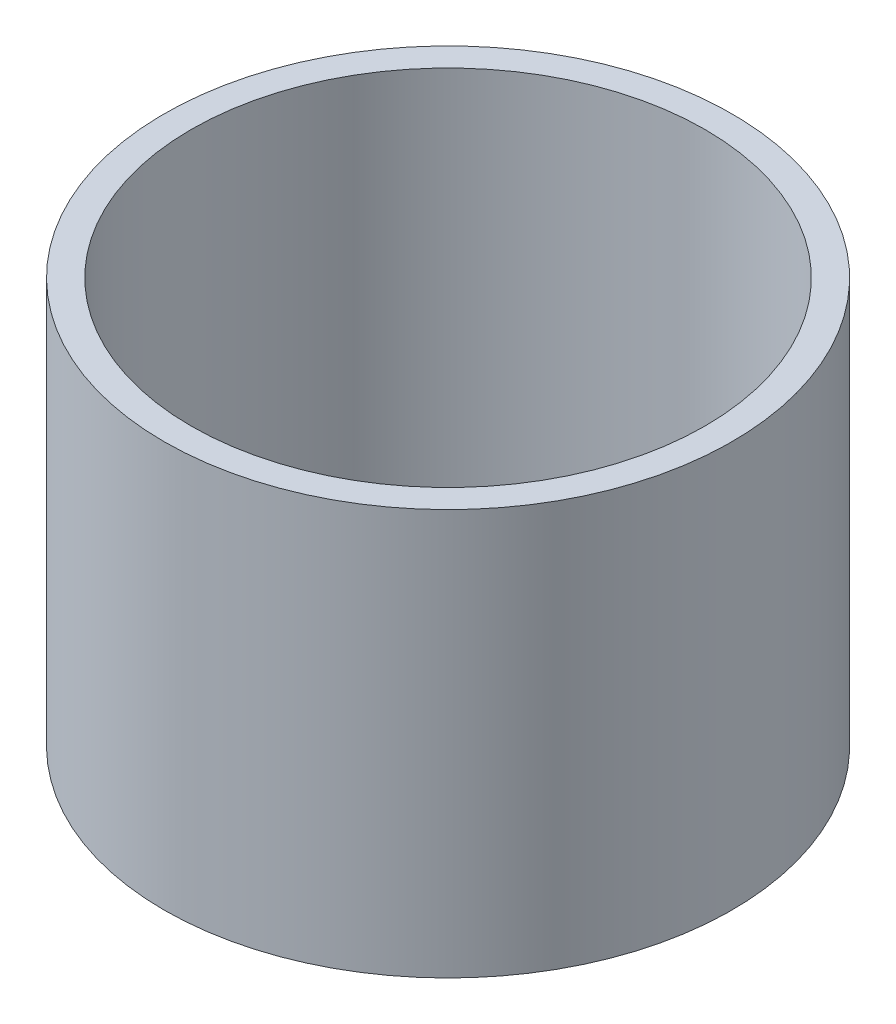
ISO-10303-21;
HEADER;
FILE_DESCRIPTION(('STEP AP214'),'2;1');
FILE_NAME('part.step','',(''),(''),'','','');
FILE_SCHEMA(('AUTOMOTIVE_DESIGN { 1 0 10303 214 1 1 1 1 }'));
ENDSEC;
DATA;
#1=APPLICATION_CONTEXT('core data for automotive mechanical design processes');
#2=APPLICATION_PROTOCOL_DEFINITION('international standard','automotive_design',2000,#1);
#3=PRODUCT_CONTEXT('',#1,'mechanical');
#4=PRODUCT('Part','Part','',(#3));
#5=PRODUCT_RELATED_PRODUCT_CATEGORY('part','',(#4));
#6=PRODUCT_DEFINITION_FORMATION('','',#4);
#7=PRODUCT_DEFINITION_CONTEXT('part definition',#1,'design');
#8=PRODUCT_DEFINITION('design','',#6,#7);
#9=PRODUCT_DEFINITION_SHAPE('','',#8);
#10=(LENGTH_UNIT() NAMED_UNIT(*) SI_UNIT(.MILLI.,.METRE.));
#11=(NAMED_UNIT(*) PLANE_ANGLE_UNIT() SI_UNIT($,.RADIAN.));
#12=(NAMED_UNIT(*) SI_UNIT($,.STERADIAN.) SOLID_ANGLE_UNIT());
#13=UNCERTAINTY_MEASURE_WITH_UNIT(LENGTH_MEASURE(1.E-05),#10,'distance_accuracy_value','');
#14=(GEOMETRIC_REPRESENTATION_CONTEXT(3) GLOBAL_UNCERTAINTY_ASSIGNED_CONTEXT((#13)) GLOBAL_UNIT_ASSIGNED_CONTEXT((#10,
#11,#12)) REPRESENTATION_CONTEXT('',''));
#15=CARTESIAN_POINT('',(0.,0.,0.));
#16=DIRECTION('',(0.,0.,1.));
#17=DIRECTION('',(1.,0.,0.));
#18=AXIS2_PLACEMENT_3D('',#15,#16,#17);
#19=CARTESIAN_POINT('',(0.,1.5,0.));
#20=DIRECTION('',(0.,1.,0.));
#21=DIRECTION('',(0.,0.,1.));
#22=AXIS2_PLACEMENT_3D('',#19,#20,#21);
#23=PLANE('',#22);
#24=CARTESIAN_POINT('',(0.,1.5,0.));
#25=DIRECTION('',(0.,1.,0.));
#26=DIRECTION('',(0.,0.,1.));
#27=AXIS2_PLACEMENT_3D('',#24,#25,#26);
#28=CIRCLE('',#27,1.05);
#29=CARTESIAN_POINT('',(0.,1.5,1.05));
#30=VERTEX_POINT('',#29);
#31=EDGE_CURVE('E10',#30,#30,#28,.T.);
#32=ORIENTED_EDGE('',*,*,#31,.T.);
#33=EDGE_LOOP('',(#32));
#34=FACE_BOUND('',#33,.T.);
#35=CARTESIAN_POINT('',(0.,1.5,0.));
#36=DIRECTION('',(0.,1.,0.));
#37=DIRECTION('',(0.,0.,1.));
#38=AXIS2_PLACEMENT_3D('',#35,#36,#37);
#39=CIRCLE('',#38,0.95);
#40=CARTESIAN_POINT('',(0.,1.5,0.95));
#41=VERTEX_POINT('',#40);
#42=EDGE_CURVE('E42',#41,#41,#39,.T.);
#43=ORIENTED_EDGE('',*,*,#42,.F.);
#44=EDGE_LOOP('',(#43));
#45=FACE_BOUND('',#44,.T.);
#46=ADVANCED_FACE('F31',(#34,#45),#23,.T.);
#47=CARTESIAN_POINT('',(0.,0.,0.));
#48=DIRECTION('',(0.,1.,0.));
#49=DIRECTION('',(0.,0.,1.));
#50=AXIS2_PLACEMENT_3D('',#47,#48,#49);
#51=PLANE('',#50);
#52=CARTESIAN_POINT('',(0.,0.,0.));
#53=DIRECTION('',(0.,1.,0.));
#54=DIRECTION('',(0.,0.,1.));
#55=AXIS2_PLACEMENT_3D('',#52,#53,#54);
#56=CIRCLE('',#55,1.05);
#57=CARTESIAN_POINT('',(0.,0.,1.05));
#58=VERTEX_POINT('',#57);
#59=EDGE_CURVE('E35',#58,#58,#56,.T.);
#60=ORIENTED_EDGE('',*,*,#59,.F.);
#61=EDGE_LOOP('',(#60));
#62=FACE_BOUND('',#61,.T.);
#63=CARTESIAN_POINT('',(0.,0.,0.));
#64=DIRECTION('',(0.,1.,0.));
#65=DIRECTION('',(0.,0.,1.));
#66=AXIS2_PLACEMENT_3D('',#63,#64,#65);
#67=CIRCLE('',#66,0.95);
#68=CARTESIAN_POINT('',(0.,0.,0.95));
#69=VERTEX_POINT('',#68);
#70=EDGE_CURVE('E44',#69,#69,#67,.T.);
#71=ORIENTED_EDGE('',*,*,#70,.T.);
#72=EDGE_LOOP('',(#71));
#73=FACE_BOUND('',#72,.T.);
#74=ADVANCED_FACE('F54',(#62,#73),#51,.F.);
#75=CARTESIAN_POINT('',(0.,1.5,0.));
#76=DIRECTION('',(0.,-1.,0.));
#77=DIRECTION('',(0.,0.,-1.));
#78=AXIS2_PLACEMENT_3D('',#75,#76,#77);
#79=CYLINDRICAL_SURFACE('',#78,1.05);
#80=ORIENTED_EDGE('',*,*,#31,.F.);
#81=EDGE_LOOP('',(#80));
#82=FACE_BOUND('',#81,.T.);
#83=ORIENTED_EDGE('',*,*,#59,.T.);
#84=EDGE_LOOP('',(#83));
#85=FACE_BOUND('',#84,.T.);
#86=ADVANCED_FACE('F33',(#82,#85),#79,.T.);
#87=CARTESIAN_POINT('',(0.,1.5,0.));
#88=DIRECTION('',(0.,-1.,0.));
#89=DIRECTION('',(0.,0.,-1.));
#90=AXIS2_PLACEMENT_3D('',#87,#88,#89);
#91=CYLINDRICAL_SURFACE('',#90,0.95);
#92=ORIENTED_EDGE('',*,*,#42,.T.);
#93=EDGE_LOOP('',(#92));
#94=FACE_BOUND('',#93,.T.);
#95=ORIENTED_EDGE('',*,*,#70,.F.);
#96=EDGE_LOOP('',(#95));
#97=FACE_BOUND('',#96,.T.);
#98=ADVANCED_FACE('F50',(#94,#97),#91,.F.);
#99=CLOSED_SHELL('',(#46,#74,#86,#98));
#100=MANIFOLD_SOLID_BREP('B2',#99);
#101=ADVANCED_BREP_SHAPE_REPRESENTATION('',(#18,#100),#14);
#102=SHAPE_DEFINITION_REPRESENTATION(#9,#101);
ENDSEC;
END-ISO-10303-21;
